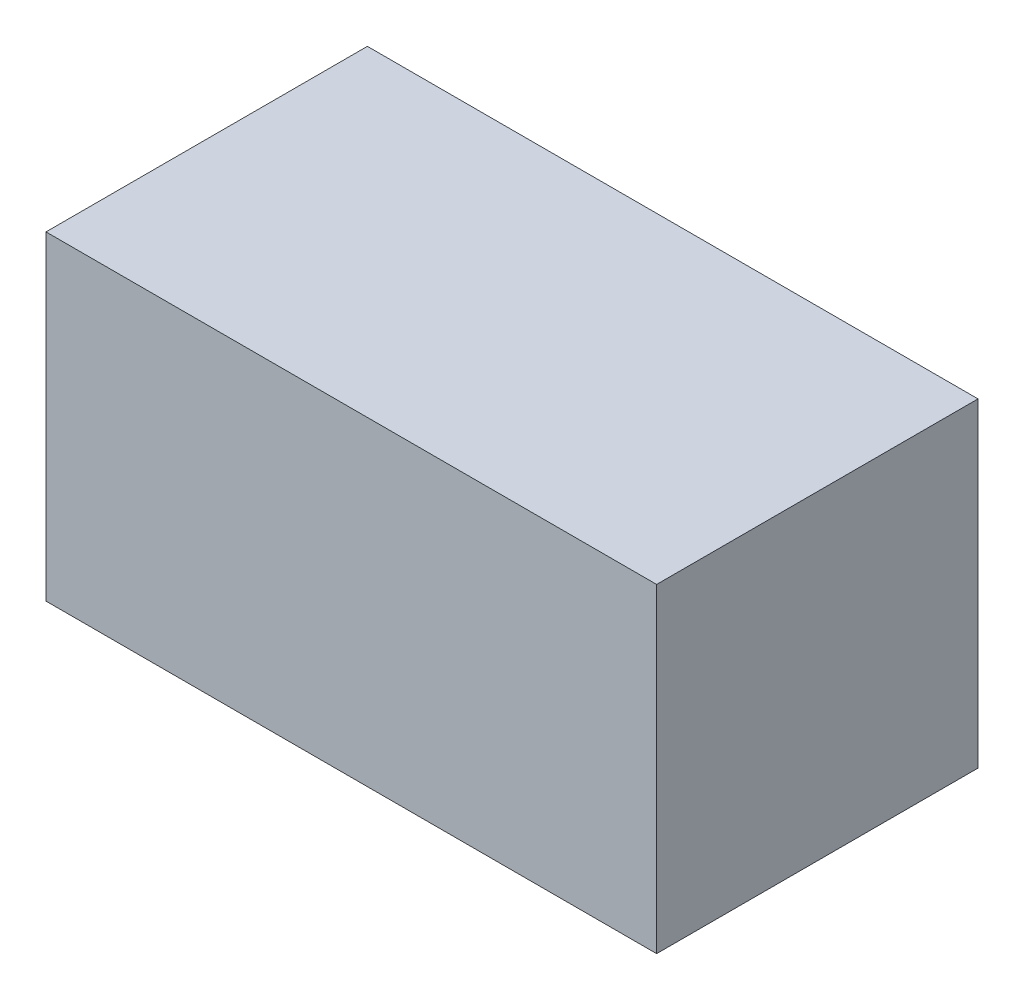
ISO-10303-21;
HEADER;
FILE_DESCRIPTION(('STEP AP214'),'2;1');
FILE_NAME('part.step','',(''),(''),'','','');
FILE_SCHEMA(('AUTOMOTIVE_DESIGN { 1 0 10303 214 1 1 1 1 }'));
ENDSEC;
DATA;
#1=APPLICATION_CONTEXT('core data for automotive mechanical design processes');
#2=APPLICATION_PROTOCOL_DEFINITION('international standard','automotive_design',2000,#1);
#3=PRODUCT_CONTEXT('',#1,'mechanical');
#4=PRODUCT('Part','Part','',(#3));
#5=PRODUCT_RELATED_PRODUCT_CATEGORY('part','',(#4));
#6=PRODUCT_DEFINITION_FORMATION('','',#4);
#7=PRODUCT_DEFINITION_CONTEXT('part definition',#1,'design');
#8=PRODUCT_DEFINITION('design','',#6,#7);
#9=PRODUCT_DEFINITION_SHAPE('','',#8);
#10=(LENGTH_UNIT() NAMED_UNIT(*) SI_UNIT(.MILLI.,.METRE.));
#11=(NAMED_UNIT(*) PLANE_ANGLE_UNIT() SI_UNIT($,.RADIAN.));
#12=(NAMED_UNIT(*) SI_UNIT($,.STERADIAN.) SOLID_ANGLE_UNIT());
#13=UNCERTAINTY_MEASURE_WITH_UNIT(LENGTH_MEASURE(1.E-05),#10,'distance_accuracy_value','');
#14=(GEOMETRIC_REPRESENTATION_CONTEXT(3) GLOBAL_UNCERTAINTY_ASSIGNED_CONTEXT((#13)) GLOBAL_UNIT_ASSIGNED_CONTEXT((#10,
#11,#12)) REPRESENTATION_CONTEXT('',''));
#15=CARTESIAN_POINT('',(0.,0.,0.));
#16=DIRECTION('',(0.,0.,1.));
#17=DIRECTION('',(1.,0.,0.));
#18=AXIS2_PLACEMENT_3D('',#15,#16,#17);
#19=CARTESIAN_POINT('',(0.95,-0.495,0.));
#20=DIRECTION('',(0.,-1.,0.));
#21=DIRECTION('',(0.,0.,-1.));
#22=AXIS2_PLACEMENT_3D('',#19,#20,#21);
#23=PLANE('',#22);
#24=DIRECTION('',(0.,0.,1.));
#25=VECTOR('',#24,1.);
#26=CARTESIAN_POINT('',(-0.95,-0.495,0.));
#27=LINE('',#26,#25);
#28=CARTESIAN_POINT('',(-0.95,-0.495,0.));
#29=VERTEX_POINT('',#28);
#30=CARTESIAN_POINT('',(-0.95,-0.495,1.));
#31=VERTEX_POINT('',#30);
#32=EDGE_CURVE('E20',#29,#31,#27,.T.);
#33=ORIENTED_EDGE('',*,*,#32,.F.);
#34=DIRECTION('',(1.,0.,0.));
#35=VECTOR('',#34,1.);
#36=CARTESIAN_POINT('',(-0.95,-0.495,0.));
#37=LINE('',#36,#35);
#38=CARTESIAN_POINT('',(0.95,-0.495,0.));
#39=VERTEX_POINT('',#38);
#40=EDGE_CURVE('E80',#29,#39,#37,.T.);
#41=ORIENTED_EDGE('',*,*,#40,.T.);
#42=DIRECTION('',(0.,0.,-1.));
#43=VECTOR('',#42,1.);
#44=CARTESIAN_POINT('',(0.95,-0.495,0.));
#45=LINE('',#44,#43);
#46=CARTESIAN_POINT('',(0.95,-0.495,1.));
#47=VERTEX_POINT('',#46);
#48=EDGE_CURVE('E68',#47,#39,#45,.T.);
#49=ORIENTED_EDGE('',*,*,#48,.F.);
#50=DIRECTION('',(1.,0.,0.));
#51=VECTOR('',#50,1.);
#52=CARTESIAN_POINT('',(-0.95,-0.495,1.));
#53=LINE('',#52,#51);
#54=EDGE_CURVE('E56',#31,#47,#53,.T.);
#55=ORIENTED_EDGE('',*,*,#54,.F.);
#56=EDGE_LOOP('',(#33,#41,#49,#55));
#57=FACE_BOUND('',#56,.T.);
#58=ADVANCED_FACE('F17',(#57),#23,.T.);
#59=CARTESIAN_POINT('',(-0.95,-0.495,0.));
#60=DIRECTION('',(-1.,0.,0.));
#61=DIRECTION('',(0.,0.,1.));
#62=AXIS2_PLACEMENT_3D('',#59,#60,#61);
#63=PLANE('',#62);
#64=DIRECTION('',(0.,0.,1.));
#65=VECTOR('',#64,1.);
#66=CARTESIAN_POINT('',(-0.95,0.5,0.));
#67=LINE('',#66,#65);
#68=CARTESIAN_POINT('',(-0.95,0.5,0.));
#69=VERTEX_POINT('',#68);
#70=CARTESIAN_POINT('',(-0.95,0.5,1.));
#71=VERTEX_POINT('',#70);
#72=EDGE_CURVE('E83',#69,#71,#67,.T.);
#73=ORIENTED_EDGE('',*,*,#72,.F.);
#74=DIRECTION('',(0.,1.,0.));
#75=VECTOR('',#74,1.);
#76=CARTESIAN_POINT('',(-0.95,0.5,0.));
#77=LINE('',#76,#75);
#78=EDGE_CURVE('E65',#69,#29,#77,.F.);
#79=ORIENTED_EDGE('',*,*,#78,.T.);
#80=ORIENTED_EDGE('',*,*,#32,.T.);
#81=DIRECTION('',(0.,1.,0.));
#82=VECTOR('',#81,1.);
#83=CARTESIAN_POINT('',(-0.95,0.5,1.));
#84=LINE('',#83,#82);
#85=EDGE_CURVE('E62',#71,#31,#84,.F.);
#86=ORIENTED_EDGE('',*,*,#85,.F.);
#87=EDGE_LOOP('',(#73,#79,#80,#86));
#88=FACE_BOUND('',#87,.T.);
#89=ADVANCED_FACE('F61',(#88),#63,.T.);
#90=CARTESIAN_POINT('',(-0.95,0.5,1.));
#91=DIRECTION('',(0.,0.,1.));
#92=DIRECTION('',(1.,0.,0.));
#93=AXIS2_PLACEMENT_3D('',#90,#91,#92);
#94=PLANE('',#93);
#95=DIRECTION('',(0.,1.,0.));
#96=VECTOR('',#95,1.);
#97=CARTESIAN_POINT('',(0.95,0.5,1.));
#98=LINE('',#97,#96);
#99=CARTESIAN_POINT('',(0.95,0.5,1.));
#100=VERTEX_POINT('',#99);
#101=EDGE_CURVE('E70',#100,#47,#98,.F.);
#102=ORIENTED_EDGE('',*,*,#101,.F.);
#103=DIRECTION('',(1.,0.,0.));
#104=VECTOR('',#103,1.);
#105=CARTESIAN_POINT('',(-0.95,0.5,1.));
#106=LINE('',#105,#104);
#107=EDGE_CURVE('E74',#71,#100,#106,.T.);
#108=ORIENTED_EDGE('',*,*,#107,.F.);
#109=ORIENTED_EDGE('',*,*,#85,.T.);
#110=ORIENTED_EDGE('',*,*,#54,.T.);
#111=EDGE_LOOP('',(#102,#108,#109,#110));
#112=FACE_BOUND('',#111,.T.);
#113=ADVANCED_FACE('F72',(#112),#94,.T.);
#114=CARTESIAN_POINT('',(0.95,0.5,0.));
#115=DIRECTION('',(1.,0.,0.));
#116=DIRECTION('',(0.,0.,-1.));
#117=AXIS2_PLACEMENT_3D('',#114,#115,#116);
#118=PLANE('',#117);
#119=ORIENTED_EDGE('',*,*,#48,.T.);
#120=DIRECTION('',(0.,1.,0.));
#121=VECTOR('',#120,1.);
#122=CARTESIAN_POINT('',(0.95,0.5,0.));
#123=LINE('',#122,#121);
#124=CARTESIAN_POINT('',(0.95,0.5,0.));
#125=VERTEX_POINT('',#124);
#126=EDGE_CURVE('E35',#39,#125,#123,.T.);
#127=ORIENTED_EDGE('',*,*,#126,.T.);
#128=DIRECTION('',(0.,0.,1.));
#129=VECTOR('',#128,1.);
#130=CARTESIAN_POINT('',(0.95,0.5,0.));
#131=LINE('',#130,#129);
#132=EDGE_CURVE('E26',#100,#125,#131,.F.);
#133=ORIENTED_EDGE('',*,*,#132,.F.);
#134=ORIENTED_EDGE('',*,*,#101,.T.);
#135=EDGE_LOOP('',(#119,#127,#133,#134));
#136=FACE_BOUND('',#135,.T.);
#137=ADVANCED_FACE('F89',(#136),#118,.T.);
#138=CARTESIAN_POINT('',(-0.95,0.5,0.));
#139=DIRECTION('',(0.,0.,1.));
#140=DIRECTION('',(1.,0.,0.));
#141=AXIS2_PLACEMENT_3D('',#138,#139,#140);
#142=PLANE('',#141);
#143=ORIENTED_EDGE('',*,*,#126,.F.);
#144=ORIENTED_EDGE('',*,*,#40,.F.);
#145=ORIENTED_EDGE('',*,*,#78,.F.);
#146=DIRECTION('',(1.,0.,0.));
#147=VECTOR('',#146,1.);
#148=CARTESIAN_POINT('',(-0.95,0.5,0.));
#149=LINE('',#148,#147);
#150=EDGE_CURVE('E11',#125,#69,#149,.F.);
#151=ORIENTED_EDGE('',*,*,#150,.F.);
#152=EDGE_LOOP('',(#143,#144,#145,#151));
#153=FACE_BOUND('',#152,.T.);
#154=ADVANCED_FACE('F91',(#153),#142,.F.);
#155=CARTESIAN_POINT('',(-0.95,0.5,0.));
#156=DIRECTION('',(0.,1.,0.));
#157=DIRECTION('',(0.,0.,1.));
#158=AXIS2_PLACEMENT_3D('',#155,#156,#157);
#159=PLANE('',#158);
#160=ORIENTED_EDGE('',*,*,#132,.T.);
#161=ORIENTED_EDGE('',*,*,#150,.T.);
#162=ORIENTED_EDGE('',*,*,#72,.T.);
#163=ORIENTED_EDGE('',*,*,#107,.T.);
#164=EDGE_LOOP('',(#160,#161,#162,#163));
#165=FACE_BOUND('',#164,.T.);
#166=ADVANCED_FACE('F88',(#165),#159,.T.);
#167=CLOSED_SHELL('',(#58,#89,#113,#137,#154,#166));
#168=MANIFOLD_SOLID_BREP('B1',#167);
#169=ADVANCED_BREP_SHAPE_REPRESENTATION('',(#18,#168),#14);
#170=SHAPE_DEFINITION_REPRESENTATION(#9,#169);
ENDSEC;
END-ISO-10303-21;
